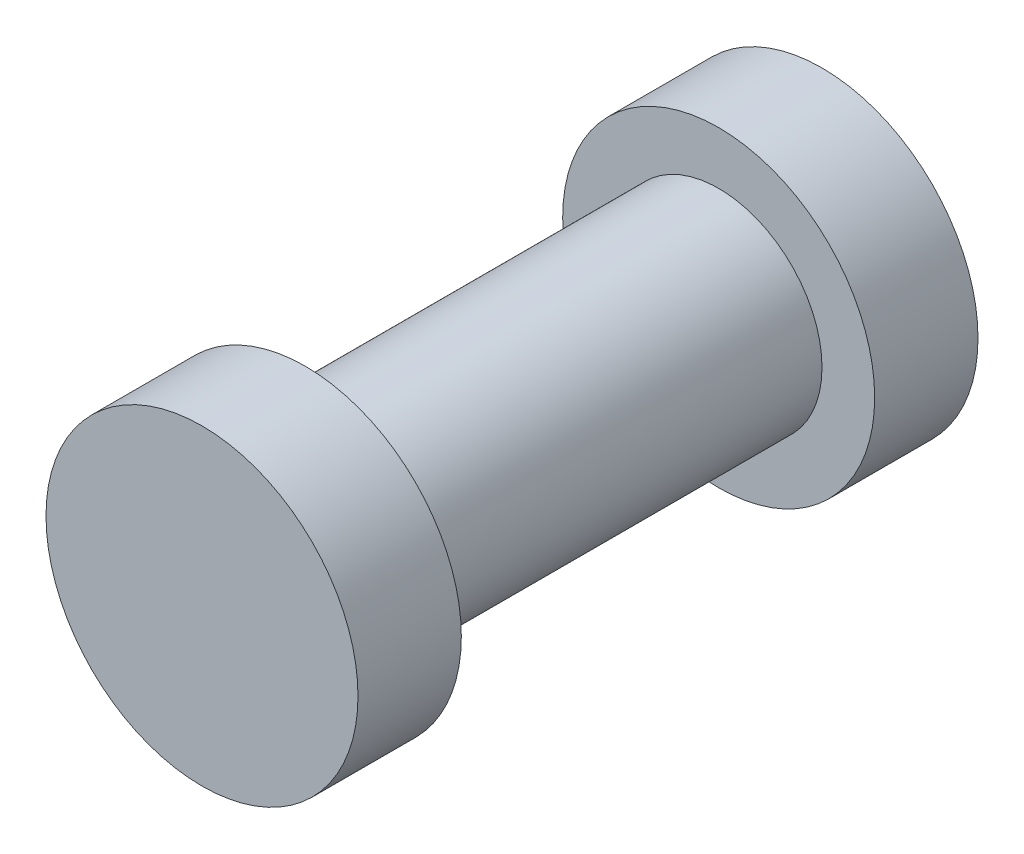
ISO-10303-21;
HEADER;
FILE_DESCRIPTION(('STEP AP214'),'2;1');
FILE_NAME('part.step','',(''),(''),'','','');
FILE_SCHEMA(('AUTOMOTIVE_DESIGN { 1 0 10303 214 1 1 1 1 }'));
ENDSEC;
DATA;
#1=APPLICATION_CONTEXT('core data for automotive mechanical design processes');
#2=APPLICATION_PROTOCOL_DEFINITION('international standard','automotive_design',2000,#1);
#3=PRODUCT_CONTEXT('',#1,'mechanical');
#4=PRODUCT('Part','Part','',(#3));
#5=PRODUCT_RELATED_PRODUCT_CATEGORY('part','',(#4));
#6=PRODUCT_DEFINITION_FORMATION('','',#4);
#7=PRODUCT_DEFINITION_CONTEXT('part definition',#1,'design');
#8=PRODUCT_DEFINITION('design','',#6,#7);
#9=PRODUCT_DEFINITION_SHAPE('','',#8);
#10=(LENGTH_UNIT() NAMED_UNIT(*) SI_UNIT(.MILLI.,.METRE.));
#11=(NAMED_UNIT(*) PLANE_ANGLE_UNIT() SI_UNIT($,.RADIAN.));
#12=(NAMED_UNIT(*) SI_UNIT($,.STERADIAN.) SOLID_ANGLE_UNIT());
#13=UNCERTAINTY_MEASURE_WITH_UNIT(LENGTH_MEASURE(1.E-05),#10,'distance_accuracy_value','');
#14=(GEOMETRIC_REPRESENTATION_CONTEXT(3) GLOBAL_UNCERTAINTY_ASSIGNED_CONTEXT((#13)) GLOBAL_UNIT_ASSIGNED_CONTEXT((#10,
#11,#12)) REPRESENTATION_CONTEXT('',''));
#15=CARTESIAN_POINT('',(0.,0.,0.));
#16=DIRECTION('',(0.,0.,1.));
#17=DIRECTION('',(1.,0.,0.));
#18=AXIS2_PLACEMENT_3D('',#15,#16,#17);
#19=CARTESIAN_POINT('',(0.,0.,10.));
#20=DIRECTION('',(0.,0.,-1.));
#21=DIRECTION('',(-1.,0.,0.));
#22=AXIS2_PLACEMENT_3D('',#19,#20,#21);
#23=CYLINDRICAL_SURFACE('',#22,5.);
#24=CARTESIAN_POINT('',(0.,0.,10.));
#25=DIRECTION('',(0.,0.,1.));
#26=DIRECTION('',(1.,0.,0.));
#27=AXIS2_PLACEMENT_3D('',#24,#25,#26);
#28=CIRCLE('',#27,5.);
#29=CARTESIAN_POINT('',(5.,0.,10.));
#30=VERTEX_POINT('',#29);
#31=EDGE_CURVE('E10',#30,#30,#28,.T.);
#32=ORIENTED_EDGE('',*,*,#31,.F.);
#33=EDGE_LOOP('',(#32));
#34=FACE_BOUND('',#33,.T.);
#35=CARTESIAN_POINT('',(0.,0.,-10.));
#36=DIRECTION('',(0.,0.,1.));
#37=DIRECTION('',(1.,0.,0.));
#38=AXIS2_PLACEMENT_3D('',#35,#36,#37);
#39=CIRCLE('',#38,5.);
#40=CARTESIAN_POINT('',(5.,0.,-10.));
#41=VERTEX_POINT('',#40);
#42=EDGE_CURVE('E34',#41,#41,#39,.T.);
#43=ORIENTED_EDGE('',*,*,#42,.T.);
#44=EDGE_LOOP('',(#43));
#45=FACE_BOUND('',#44,.T.);
#46=ADVANCED_FACE('F31',(#34,#45),#23,.T.);
#47=CARTESIAN_POINT('',(0.,0.,15.));
#48=DIRECTION('',(0.,0.,-1.));
#49=DIRECTION('',(-1.,0.,0.));
#50=AXIS2_PLACEMENT_3D('',#47,#48,#49);
#51=CYLINDRICAL_SURFACE('',#50,7.54833615841361);
#52=CARTESIAN_POINT('',(0.,0.,15.));
#53=DIRECTION('',(0.,0.,1.));
#54=DIRECTION('',(1.,0.,0.));
#55=AXIS2_PLACEMENT_3D('',#52,#53,#54);
#56=CIRCLE('',#55,7.54833615841361);
#57=CARTESIAN_POINT('',(7.54833615841361,0.,15.));
#58=VERTEX_POINT('',#57);
#59=EDGE_CURVE('E38',#58,#58,#56,.T.);
#60=ORIENTED_EDGE('',*,*,#59,.F.);
#61=EDGE_LOOP('',(#60));
#62=FACE_BOUND('',#61,.T.);
#63=CARTESIAN_POINT('',(0.,0.,10.));
#64=DIRECTION('',(0.,0.,1.));
#65=DIRECTION('',(1.,0.,0.));
#66=AXIS2_PLACEMENT_3D('',#63,#64,#65);
#67=CIRCLE('',#66,7.54833615841361);
#68=CARTESIAN_POINT('',(7.54833615841361,0.,10.));
#69=VERTEX_POINT('',#68);
#70=EDGE_CURVE('E42',#69,#69,#67,.T.);
#71=ORIENTED_EDGE('',*,*,#70,.T.);
#72=EDGE_LOOP('',(#71));
#73=FACE_BOUND('',#72,.T.);
#74=ADVANCED_FACE('F79',(#62,#73),#51,.T.);
#75=CARTESIAN_POINT('',(0.,0.,15.));
#76=DIRECTION('',(0.,0.,1.));
#77=DIRECTION('',(1.,0.,0.));
#78=AXIS2_PLACEMENT_3D('',#75,#76,#77);
#79=PLANE('',#78);
#80=ORIENTED_EDGE('',*,*,#59,.T.);
#81=EDGE_LOOP('',(#80));
#82=FACE_BOUND('',#81,.T.);
#83=ADVANCED_FACE('F75',(#82),#79,.T.);
#84=CARTESIAN_POINT('',(0.,0.,10.));
#85=DIRECTION('',(0.,0.,1.));
#86=DIRECTION('',(1.,0.,0.));
#87=AXIS2_PLACEMENT_3D('',#84,#85,#86);
#88=PLANE('',#87);
#89=ORIENTED_EDGE('',*,*,#31,.T.);
#90=EDGE_LOOP('',(#89));
#91=FACE_BOUND('',#90,.T.);
#92=ORIENTED_EDGE('',*,*,#70,.F.);
#93=EDGE_LOOP('',(#92));
#94=FACE_BOUND('',#93,.T.);
#95=ADVANCED_FACE('F67',(#91,#94),#88,.F.);
#96=CARTESIAN_POINT('',(0.,0.,-15.));
#97=DIRECTION('',(0.,0.,1.));
#98=DIRECTION('',(1.,0.,0.));
#99=AXIS2_PLACEMENT_3D('',#96,#97,#98);
#100=CYLINDRICAL_SURFACE('',#99,7.54833615841361);
#101=CARTESIAN_POINT('',(0.,0.,-15.));
#102=DIRECTION('',(0.,0.,-1.));
#103=DIRECTION('',(-1.,0.,0.));
#104=AXIS2_PLACEMENT_3D('',#101,#102,#103);
#105=CIRCLE('',#104,7.54833615841361);
#106=CARTESIAN_POINT('',(-7.54833615841361,0.,-15.));
#107=VERTEX_POINT('',#106);
#108=EDGE_CURVE('E50',#107,#107,#105,.T.);
#109=ORIENTED_EDGE('',*,*,#108,.F.);
#110=EDGE_LOOP('',(#109));
#111=FACE_BOUND('',#110,.T.);
#112=CARTESIAN_POINT('',(0.,0.,-10.));
#113=DIRECTION('',(0.,0.,-1.));
#114=DIRECTION('',(-1.,0.,0.));
#115=AXIS2_PLACEMENT_3D('',#112,#113,#114);
#116=CIRCLE('',#115,7.54833615841361);
#117=CARTESIAN_POINT('',(-7.54833615841361,0.,-10.));
#118=VERTEX_POINT('',#117);
#119=EDGE_CURVE('E47',#118,#118,#116,.T.);
#120=ORIENTED_EDGE('',*,*,#119,.T.);
#121=EDGE_LOOP('',(#120));
#122=FACE_BOUND('',#121,.T.);
#123=ADVANCED_FACE('F65',(#111,#122),#100,.T.);
#124=CARTESIAN_POINT('',(0.,0.,-15.));
#125=DIRECTION('',(0.,0.,-1.));
#126=DIRECTION('',(-1.,0.,0.));
#127=AXIS2_PLACEMENT_3D('',#124,#125,#126);
#128=PLANE('',#127);
#129=ORIENTED_EDGE('',*,*,#108,.T.);
#130=EDGE_LOOP('',(#129));
#131=FACE_BOUND('',#130,.T.);
#132=ADVANCED_FACE('F61',(#131),#128,.T.);
#133=CARTESIAN_POINT('',(0.,0.,-10.));
#134=DIRECTION('',(0.,0.,-1.));
#135=DIRECTION('',(-1.,0.,0.));
#136=AXIS2_PLACEMENT_3D('',#133,#134,#135);
#137=PLANE('',#136);
#138=ORIENTED_EDGE('',*,*,#42,.F.);
#139=EDGE_LOOP('',(#138));
#140=FACE_BOUND('',#139,.T.);
#141=ORIENTED_EDGE('',*,*,#119,.F.);
#142=EDGE_LOOP('',(#141));
#143=FACE_BOUND('',#142,.T.);
#144=ADVANCED_FACE('F58',(#140,#143),#137,.F.);
#145=CLOSED_SHELL('',(#46,#74,#83,#95,#123,#132,#144));
#146=MANIFOLD_SOLID_BREP('B2',#145);
#147=ADVANCED_BREP_SHAPE_REPRESENTATION('',(#18,#146),#14);
#148=SHAPE_DEFINITION_REPRESENTATION(#9,#147);
ENDSEC;
END-ISO-10303-21;
